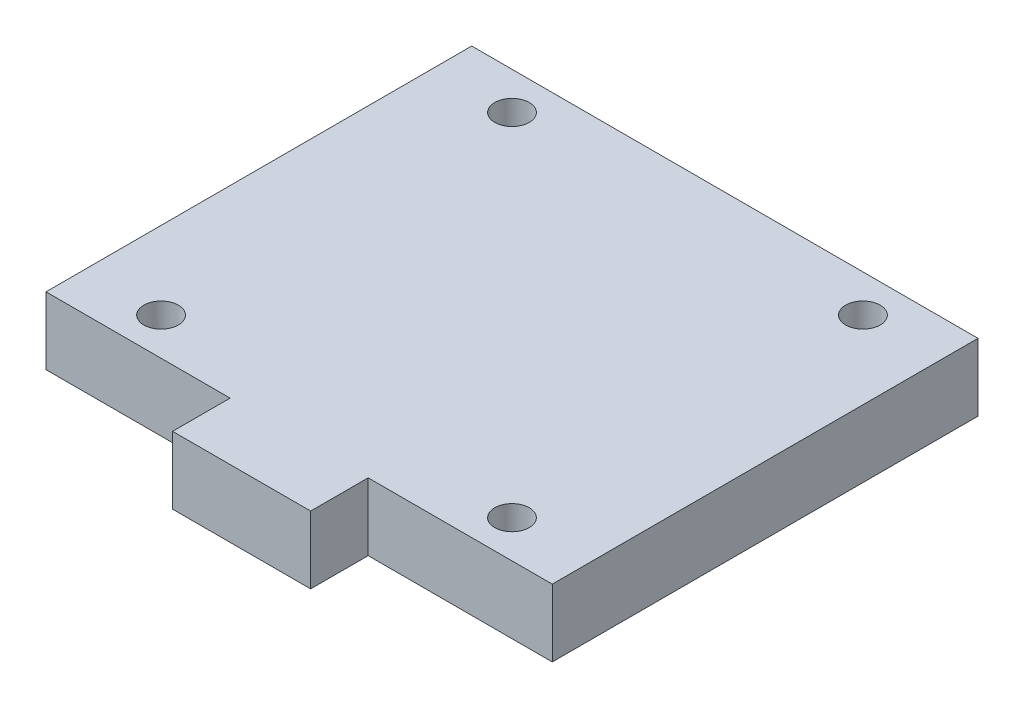
ISO-10303-21;
HEADER;
FILE_DESCRIPTION(('STEP AP214'),'2;1');
FILE_NAME('part.step','',(''),(''),'','','');
FILE_SCHEMA(('AUTOMOTIVE_DESIGN { 1 0 10303 214 1 1 1 1 }'));
ENDSEC;
DATA;
#1=APPLICATION_CONTEXT('core data for automotive mechanical design processes');
#2=APPLICATION_PROTOCOL_DEFINITION('international standard','automotive_design',2000,#1);
#3=PRODUCT_CONTEXT('',#1,'mechanical');
#4=PRODUCT('Part','Part','',(#3));
#5=PRODUCT_RELATED_PRODUCT_CATEGORY('part','',(#4));
#6=PRODUCT_DEFINITION_FORMATION('','',#4);
#7=PRODUCT_DEFINITION_CONTEXT('part definition',#1,'design');
#8=PRODUCT_DEFINITION('design','',#6,#7);
#9=PRODUCT_DEFINITION_SHAPE('','',#8);
#10=(LENGTH_UNIT() NAMED_UNIT(*) SI_UNIT(.MILLI.,.METRE.));
#11=(NAMED_UNIT(*) PLANE_ANGLE_UNIT() SI_UNIT($,.RADIAN.));
#12=(NAMED_UNIT(*) SI_UNIT($,.STERADIAN.) SOLID_ANGLE_UNIT());
#13=UNCERTAINTY_MEASURE_WITH_UNIT(LENGTH_MEASURE(1.E-05),#10,'distance_accuracy_value','');
#14=(GEOMETRIC_REPRESENTATION_CONTEXT(3) GLOBAL_UNCERTAINTY_ASSIGNED_CONTEXT((#13)) GLOBAL_UNIT_ASSIGNED_CONTEXT((#10,
#11,#12)) REPRESENTATION_CONTEXT('',''));
#15=CARTESIAN_POINT('',(0.,0.,0.));
#16=DIRECTION('',(0.,0.,1.));
#17=DIRECTION('',(1.,0.,0.));
#18=AXIS2_PLACEMENT_3D('',#15,#16,#17);
#19=CARTESIAN_POINT('',(0.,5.86,18.5));
#20=DIRECTION('',(0.,0.,-1.));
#21=DIRECTION('',(-1.,0.,0.));
#22=AXIS2_PLACEMENT_3D('',#19,#20,#21);
#23=PLANE('',#22);
#24=DIRECTION('',(1.,0.,0.));
#25=VECTOR('',#24,1.);
#26=CARTESIAN_POINT('',(0.,0.,18.5));
#27=LINE('',#26,#25);
#28=CARTESIAN_POINT('',(-22.,0.,18.5));
#29=VERTEX_POINT('',#28);
#30=CARTESIAN_POINT('',(-6.,0.,18.5));
#31=VERTEX_POINT('',#30);
#32=EDGE_CURVE('E148',#29,#31,#27,.T.);
#33=ORIENTED_EDGE('',*,*,#32,.T.);
#34=DIRECTION('',(0.,-1.,0.));
#35=VECTOR('',#34,1.);
#36=CARTESIAN_POINT('',(-6.,5.86,18.5));
#37=LINE('',#36,#35);
#38=CARTESIAN_POINT('',(-6.,5.86,18.5));
#39=VERTEX_POINT('',#38);
#40=EDGE_CURVE('E11',#39,#31,#37,.T.);
#41=ORIENTED_EDGE('',*,*,#40,.F.);
#42=DIRECTION('',(1.,0.,0.));
#43=VECTOR('',#42,1.);
#44=CARTESIAN_POINT('',(0.,5.86,18.5));
#45=LINE('',#44,#43);
#46=CARTESIAN_POINT('',(-22.,5.86,18.5));
#47=VERTEX_POINT('',#46);
#48=EDGE_CURVE('E188',#47,#39,#45,.T.);
#49=ORIENTED_EDGE('',*,*,#48,.F.);
#50=DIRECTION('',(0.,-1.,0.));
#51=VECTOR('',#50,1.);
#52=CARTESIAN_POINT('',(-22.,5.86,18.5));
#53=LINE('',#52,#51);
#54=EDGE_CURVE('E54',#47,#29,#53,.T.);
#55=ORIENTED_EDGE('',*,*,#54,.T.);
#56=EDGE_LOOP('',(#33,#41,#49,#55));
#57=FACE_BOUND('',#56,.T.);
#58=ADVANCED_FACE('F37',(#57),#23,.F.);
#59=CARTESIAN_POINT('',(-6.,5.86,0.));
#60=DIRECTION('',(1.,0.,0.));
#61=DIRECTION('',(0.,0.,-1.));
#62=AXIS2_PLACEMENT_3D('',#59,#60,#61);
#63=PLANE('',#62);
#64=DIRECTION('',(0.,0.,1.));
#65=VECTOR('',#64,1.);
#66=CARTESIAN_POINT('',(-6.,0.,0.));
#67=LINE('',#66,#65);
#68=CARTESIAN_POINT('',(-5.99999999999999,0.,23.5));
#69=VERTEX_POINT('',#68);
#70=EDGE_CURVE('E150',#31,#69,#67,.T.);
#71=ORIENTED_EDGE('',*,*,#70,.T.);
#72=DIRECTION('',(0.,-1.,0.));
#73=VECTOR('',#72,1.);
#74=CARTESIAN_POINT('',(-5.99999999999999,5.86,23.5));
#75=LINE('',#74,#73);
#76=CARTESIAN_POINT('',(-5.99999999999999,5.86,23.5));
#77=VERTEX_POINT('',#76);
#78=EDGE_CURVE('E46',#77,#69,#75,.T.);
#79=ORIENTED_EDGE('',*,*,#78,.F.);
#80=DIRECTION('',(0.,0.,1.));
#81=VECTOR('',#80,1.);
#82=CARTESIAN_POINT('',(-6.,5.86,0.));
#83=LINE('',#82,#81);
#84=EDGE_CURVE('E92',#39,#77,#83,.T.);
#85=ORIENTED_EDGE('',*,*,#84,.F.);
#86=ORIENTED_EDGE('',*,*,#40,.T.);
#87=EDGE_LOOP('',(#71,#79,#85,#86));
#88=FACE_BOUND('',#87,.T.);
#89=ADVANCED_FACE('F231',(#88),#63,.F.);
#90=CARTESIAN_POINT('',(0.,5.86,23.5));
#91=DIRECTION('',(0.,0.,-1.));
#92=DIRECTION('',(-1.,0.,0.));
#93=AXIS2_PLACEMENT_3D('',#90,#91,#92);
#94=PLANE('',#93);
#95=DIRECTION('',(1.,0.,0.));
#96=VECTOR('',#95,1.);
#97=CARTESIAN_POINT('',(0.,0.,23.5));
#98=LINE('',#97,#96);
#99=CARTESIAN_POINT('',(6.00000000000001,0.,23.5));
#100=VERTEX_POINT('',#99);
#101=EDGE_CURVE('E153',#69,#100,#98,.T.);
#102=ORIENTED_EDGE('',*,*,#101,.T.);
#103=DIRECTION('',(0.,-1.,0.));
#104=VECTOR('',#103,1.);
#105=CARTESIAN_POINT('',(6.00000000000001,5.86,23.5));
#106=LINE('',#105,#104);
#107=CARTESIAN_POINT('',(6.00000000000001,5.86,23.5));
#108=VERTEX_POINT('',#107);
#109=EDGE_CURVE('E171',#108,#100,#106,.T.);
#110=ORIENTED_EDGE('',*,*,#109,.F.);
#111=DIRECTION('',(1.,0.,0.));
#112=VECTOR('',#111,1.);
#113=CARTESIAN_POINT('',(0.,5.86,23.5));
#114=LINE('',#113,#112);
#115=EDGE_CURVE('E178',#77,#108,#114,.T.);
#116=ORIENTED_EDGE('',*,*,#115,.F.);
#117=ORIENTED_EDGE('',*,*,#78,.T.);
#118=EDGE_LOOP('',(#102,#110,#116,#117));
#119=FACE_BOUND('',#118,.T.);
#120=ADVANCED_FACE('F176',(#119),#94,.F.);
#121=CARTESIAN_POINT('',(6.00000000000001,5.86,0.));
#122=DIRECTION('',(1.,0.,0.));
#123=DIRECTION('',(0.,0.,-1.));
#124=AXIS2_PLACEMENT_3D('',#121,#122,#123);
#125=PLANE('',#124);
#126=DIRECTION('',(0.,0.,1.));
#127=VECTOR('',#126,1.);
#128=CARTESIAN_POINT('',(6.00000000000001,0.,0.));
#129=LINE('',#128,#127);
#130=CARTESIAN_POINT('',(6.00000000000001,0.,18.5));
#131=VERTEX_POINT('',#130);
#132=EDGE_CURVE('E156',#131,#100,#129,.T.);
#133=ORIENTED_EDGE('',*,*,#132,.F.);
#134=DIRECTION('',(0.,-1.,0.));
#135=VECTOR('',#134,1.);
#136=CARTESIAN_POINT('',(6.00000000000001,5.86,18.5));
#137=LINE('',#136,#135);
#138=CARTESIAN_POINT('',(6.00000000000001,5.86,18.5));
#139=VERTEX_POINT('',#138);
#140=EDGE_CURVE('E169',#139,#131,#137,.T.);
#141=ORIENTED_EDGE('',*,*,#140,.F.);
#142=DIRECTION('',(0.,0.,1.));
#143=VECTOR('',#142,1.);
#144=CARTESIAN_POINT('',(6.00000000000001,5.86,0.));
#145=LINE('',#144,#143);
#146=EDGE_CURVE('E186',#139,#108,#145,.T.);
#147=ORIENTED_EDGE('',*,*,#146,.T.);
#148=ORIENTED_EDGE('',*,*,#109,.T.);
#149=EDGE_LOOP('',(#133,#141,#147,#148));
#150=FACE_BOUND('',#149,.T.);
#151=ADVANCED_FACE('F184',(#150),#125,.T.);
#152=CARTESIAN_POINT('',(22.,0.,18.5));
#153=VERTEX_POINT('',#152);
#154=EDGE_CURVE('E151',#131,#153,#27,.T.);
#155=ORIENTED_EDGE('',*,*,#154,.T.);
#156=DIRECTION('',(0.,-1.,0.));
#157=VECTOR('',#156,1.);
#158=CARTESIAN_POINT('',(22.,5.86,18.5));
#159=LINE('',#158,#157);
#160=CARTESIAN_POINT('',(22.,5.86,18.5));
#161=VERTEX_POINT('',#160);
#162=EDGE_CURVE('E128',#161,#153,#159,.T.);
#163=ORIENTED_EDGE('',*,*,#162,.F.);
#164=EDGE_CURVE('E116',#139,#161,#45,.T.);
#165=ORIENTED_EDGE('',*,*,#164,.F.);
#166=ORIENTED_EDGE('',*,*,#140,.T.);
#167=EDGE_LOOP('',(#155,#163,#165,#166));
#168=FACE_BOUND('',#167,.T.);
#169=ADVANCED_FACE('F233',(#168),#23,.F.);
#170=CARTESIAN_POINT('',(22.,5.86,0.));
#171=DIRECTION('',(-1.,0.,0.));
#172=DIRECTION('',(0.,0.,1.));
#173=AXIS2_PLACEMENT_3D('',#170,#171,#172);
#174=PLANE('',#173);
#175=DIRECTION('',(0.,0.,-1.));
#176=VECTOR('',#175,1.);
#177=CARTESIAN_POINT('',(22.,0.,0.));
#178=LINE('',#177,#176);
#179=CARTESIAN_POINT('',(22.,0.,-18.5));
#180=VERTEX_POINT('',#179);
#181=EDGE_CURVE('E125',#153,#180,#178,.T.);
#182=ORIENTED_EDGE('',*,*,#181,.T.);
#183=DIRECTION('',(0.,-1.,0.));
#184=VECTOR('',#183,1.);
#185=CARTESIAN_POINT('',(22.,5.86,-18.5));
#186=LINE('',#185,#184);
#187=CARTESIAN_POINT('',(22.,5.86,-18.5));
#188=VERTEX_POINT('',#187);
#189=EDGE_CURVE('E122',#188,#180,#186,.T.);
#190=ORIENTED_EDGE('',*,*,#189,.F.);
#191=DIRECTION('',(0.,0.,-1.));
#192=VECTOR('',#191,1.);
#193=CARTESIAN_POINT('',(22.,5.86,0.));
#194=LINE('',#193,#192);
#195=EDGE_CURVE('E108',#161,#188,#194,.T.);
#196=ORIENTED_EDGE('',*,*,#195,.F.);
#197=ORIENTED_EDGE('',*,*,#162,.T.);
#198=EDGE_LOOP('',(#182,#190,#196,#197));
#199=FACE_BOUND('',#198,.T.);
#200=ADVANCED_FACE('F123',(#199),#174,.F.);
#201=CARTESIAN_POINT('',(0.,5.86,-18.5));
#202=DIRECTION('',(0.,0.,-1.));
#203=DIRECTION('',(-1.,0.,0.));
#204=AXIS2_PLACEMENT_3D('',#201,#202,#203);
#205=PLANE('',#204);
#206=DIRECTION('',(1.,0.,0.));
#207=VECTOR('',#206,1.);
#208=CARTESIAN_POINT('',(0.,0.,-18.5));
#209=LINE('',#208,#207);
#210=CARTESIAN_POINT('',(-22.,0.,-18.5));
#211=VERTEX_POINT('',#210);
#212=EDGE_CURVE('E160',#211,#180,#209,.T.);
#213=ORIENTED_EDGE('',*,*,#212,.F.);
#214=DIRECTION('',(0.,-1.,0.));
#215=VECTOR('',#214,1.);
#216=CARTESIAN_POINT('',(-22.,5.86,-18.5));
#217=LINE('',#216,#215);
#218=CARTESIAN_POINT('',(-22.,5.86,-18.5));
#219=VERTEX_POINT('',#218);
#220=EDGE_CURVE('E80',#219,#211,#217,.T.);
#221=ORIENTED_EDGE('',*,*,#220,.F.);
#222=DIRECTION('',(1.,0.,0.));
#223=VECTOR('',#222,1.);
#224=CARTESIAN_POINT('',(0.,5.86,-18.5));
#225=LINE('',#224,#223);
#226=EDGE_CURVE('E113',#219,#188,#225,.T.);
#227=ORIENTED_EDGE('',*,*,#226,.T.);
#228=ORIENTED_EDGE('',*,*,#189,.T.);
#229=EDGE_LOOP('',(#213,#221,#227,#228));
#230=FACE_BOUND('',#229,.T.);
#231=ADVANCED_FACE('F130',(#230),#205,.T.);
#232=CARTESIAN_POINT('',(-15.25,5.86,-15.25));
#233=DIRECTION('',(0.,-1.,0.));
#234=DIRECTION('',(0.,0.,-1.));
#235=AXIS2_PLACEMENT_3D('',#232,#233,#234);
#236=CYLINDRICAL_SURFACE('',#235,1.5);
#237=CARTESIAN_POINT('',(-15.25,5.86,-15.25));
#238=DIRECTION('',(0.,1.,0.));
#239=DIRECTION('',(0.,0.,1.));
#240=AXIS2_PLACEMENT_3D('',#237,#238,#239);
#241=CIRCLE('',#240,1.5);
#242=CARTESIAN_POINT('',(-15.25,5.86,-16.75));
#243=VERTEX_POINT('',#242);
#244=EDGE_CURVE('E192',#243,#243,#241,.T.);
#245=CARTESIAN_POINT('',(-15.25,0.,-15.25));
#246=DIRECTION('',(0.,1.,0.));
#247=DIRECTION('',(0.,0.,1.));
#248=AXIS2_PLACEMENT_3D('',#245,#246,#247);
#249=CIRCLE('',#248,1.5);
#250=CARTESIAN_POINT('',(-15.25,0.,-16.75));
#251=VERTEX_POINT('',#250);
#252=EDGE_CURVE('E145',#251,#251,#249,.T.);
#253=CARTESIAN_POINT('',(-15.25,5.86,-16.75));
#254=CARTESIAN_POINT('',(-15.25,5.79895833333333,-16.75));
#255=CARTESIAN_POINT('',(-15.25,5.73791666666667,-16.75));
#256=CARTESIAN_POINT('',(-15.25,5.61583333333333,-16.75));
#257=CARTESIAN_POINT('',(-15.25,5.55479166666667,-16.75));
#258=CARTESIAN_POINT('',(-15.25,5.43270833333333,-16.75));
#259=CARTESIAN_POINT('',(-15.25,5.37166666666667,-16.75));
#260=CARTESIAN_POINT('',(-15.25,5.24958333333333,-16.75));
#261=CARTESIAN_POINT('',(-15.25,5.18854166666667,-16.75));
#262=CARTESIAN_POINT('',(-15.25,5.06645833333333,-16.75));
#263=CARTESIAN_POINT('',(-15.25,5.00541666666667,-16.75));
#264=CARTESIAN_POINT('',(-15.25,4.88333333333333,-16.75));
#265=CARTESIAN_POINT('',(-15.25,4.82229166666667,-16.75));
#266=CARTESIAN_POINT('',(-15.25,4.70020833333333,-16.75));
#267=CARTESIAN_POINT('',(-15.25,4.63916666666667,-16.75));
#268=CARTESIAN_POINT('',(-15.25,4.51708333333333,-16.75));
#269=CARTESIAN_POINT('',(-15.25,4.45604166666667,-16.75));
#270=CARTESIAN_POINT('',(-15.25,4.33395833333333,-16.75));
#271=CARTESIAN_POINT('',(-15.25,4.27291666666667,-16.75));
#272=CARTESIAN_POINT('',(-15.25,4.15083333333333,-16.75));
#273=CARTESIAN_POINT('',(-15.25,4.08979166666667,-16.75));
#274=CARTESIAN_POINT('',(-15.25,3.96770833333333,-16.75));
#275=CARTESIAN_POINT('',(-15.25,3.90666666666667,-16.75));
#276=CARTESIAN_POINT('',(-15.25,3.78458333333333,-16.75));
#277=CARTESIAN_POINT('',(-15.25,3.72354166666667,-16.75));
#278=CARTESIAN_POINT('',(-15.25,3.60145833333333,-16.75));
#279=CARTESIAN_POINT('',(-15.25,3.54041666666667,-16.75));
#280=CARTESIAN_POINT('',(-15.25,3.41833333333333,-16.75));
#281=CARTESIAN_POINT('',(-15.25,3.35729166666667,-16.75));
#282=CARTESIAN_POINT('',(-15.25,3.23520833333333,-16.75));
#283=CARTESIAN_POINT('',(-15.25,3.17416666666667,-16.75));
#284=CARTESIAN_POINT('',(-15.25,3.05208333333333,-16.75));
#285=CARTESIAN_POINT('',(-15.25,2.99104166666667,-16.75));
#286=CARTESIAN_POINT('',(-15.25,2.86895833333333,-16.75));
#287=CARTESIAN_POINT('',(-15.25,2.80791666666667,-16.75));
#288=CARTESIAN_POINT('',(-15.25,2.68583333333333,-16.75));
#289=CARTESIAN_POINT('',(-15.25,2.62479166666667,-16.75));
#290=CARTESIAN_POINT('',(-15.25,2.50270833333333,-16.75));
#291=CARTESIAN_POINT('',(-15.25,2.44166666666667,-16.75));
#292=CARTESIAN_POINT('',(-15.25,2.31958333333333,-16.75));
#293=CARTESIAN_POINT('',(-15.25,2.25854166666667,-16.75));
#294=CARTESIAN_POINT('',(-15.25,2.13645833333333,-16.75));
#295=CARTESIAN_POINT('',(-15.25,2.07541666666667,-16.75));
#296=CARTESIAN_POINT('',(-15.25,1.95333333333333,-16.75));
#297=CARTESIAN_POINT('',(-15.25,1.89229166666667,-16.75));
#298=CARTESIAN_POINT('',(-15.25,1.77020833333333,-16.75));
#299=CARTESIAN_POINT('',(-15.25,1.70916666666667,-16.75));
#300=CARTESIAN_POINT('',(-15.25,1.58708333333333,-16.75));
#301=CARTESIAN_POINT('',(-15.25,1.52604166666667,-16.75));
#302=CARTESIAN_POINT('',(-15.25,1.40395833333333,-16.75));
#303=CARTESIAN_POINT('',(-15.25,1.34291666666667,-16.75));
#304=CARTESIAN_POINT('',(-15.25,1.22083333333333,-16.75));
#305=CARTESIAN_POINT('',(-15.25,1.15979166666667,-16.75));
#306=CARTESIAN_POINT('',(-15.25,1.03770833333333,-16.75));
#307=CARTESIAN_POINT('',(-15.25,0.976666666666666,-16.75));
#308=CARTESIAN_POINT('',(-15.25,0.854583333333333,-16.75));
#309=CARTESIAN_POINT('',(-15.25,0.793541666666666,-16.75));
#310=CARTESIAN_POINT('',(-15.25,0.671458333333333,-16.75));
#311=CARTESIAN_POINT('',(-15.25,0.610416666666666,-16.75));
#312=CARTESIAN_POINT('',(-15.25,0.488333333333333,-16.75));
#313=CARTESIAN_POINT('',(-15.25,0.427291666666666,-16.75));
#314=CARTESIAN_POINT('',(-15.25,0.305208333333333,-16.75));
#315=CARTESIAN_POINT('',(-15.25,0.244166666666666,-16.75));
#316=CARTESIAN_POINT('',(-15.25,0.122083333333333,-16.75));
#317=CARTESIAN_POINT('',(-15.25,0.0610416666666659,-16.75));
#318=CARTESIAN_POINT('',(-15.25,0.,-16.75));
#319=B_SPLINE_CURVE_WITH_KNOTS('',3,(#253,#254,#255,#256,#257,#258,#259,#260,#261,#262,#263,
#264,#265,#266,#267,#268,#269,#270,#271,#272,#273,#274,#275,#276,#277,#278,#279,#280,#281,#282,
#283,#284,#285,#286,#287,#288,#289,#290,#291,#292,#293,#294,#295,#296,#297,#298,#299,#300,#301,
#302,#303,#304,#305,#306,#307,#308,#309,#310,#311,#312,#313,#314,#315,#316,#317,#318),
.UNSPECIFIED.,.F.,.F.,(4,2,2,2,2,2,2,2,2,2,2,2,2,2,2,2,2,2,2,2,2,2,2,2,2,2,2,2,2,2,2,2,4),(0.,
0.183125,0.36625,0.549375,0.7325,0.915625000000001,1.09875,1.281875,1.465,1.648125,1.83125,
2.014375,2.1975,2.380625,2.56375,2.746875,2.93,3.113125,3.29625,3.479375,3.6625,3.845625,
4.02875,4.211875,4.395,4.578125,4.76125,4.944375,5.1275,5.310625,5.49375,5.676875,5.86),.UNSPECIFIED.);
#320=EDGE_CURVE('BSEAM216',#243,#251,#319,.T.);
#321=ORIENTED_EDGE('',*,*,#244,.T.);
#322=ORIENTED_EDGE('',*,*,#252,.F.);
#323=ORIENTED_EDGE('',*,*,#320,.T.);
#324=ORIENTED_EDGE('',*,*,#320,.F.);
#325=EDGE_LOOP('',(#321,#323,#322,#324));
#326=FACE_BOUND('',#325,.T.);
#327=ADVANCED_FACE('F216',(#326),#236,.F.);
#328=CARTESIAN_POINT('',(15.25,5.86,-15.25));
#329=DIRECTION('',(0.,-1.,0.));
#330=DIRECTION('',(0.,0.,-1.));
#331=AXIS2_PLACEMENT_3D('',#328,#329,#330);
#332=CYLINDRICAL_SURFACE('',#331,1.5);
#333=CARTESIAN_POINT('',(15.25,5.86,-15.25));
#334=DIRECTION('',(0.,1.,0.));
#335=DIRECTION('',(0.,0.,1.));
#336=AXIS2_PLACEMENT_3D('',#333,#334,#335);
#337=CIRCLE('',#336,1.5);
#338=CARTESIAN_POINT('',(15.25,5.86,-16.75));
#339=VERTEX_POINT('',#338);
#340=EDGE_CURVE('E195',#339,#339,#337,.T.);
#341=CARTESIAN_POINT('',(15.25,0.,-15.25));
#342=DIRECTION('',(0.,1.,0.));
#343=DIRECTION('',(0.,0.,1.));
#344=AXIS2_PLACEMENT_3D('',#341,#342,#343);
#345=CIRCLE('',#344,1.5);
#346=CARTESIAN_POINT('',(15.25,0.,-16.75));
#347=VERTEX_POINT('',#346);
#348=EDGE_CURVE('E142',#347,#347,#345,.T.);
#349=CARTESIAN_POINT('',(15.25,5.86,-16.75));
#350=CARTESIAN_POINT('',(15.25,5.79895833333333,-16.75));
#351=CARTESIAN_POINT('',(15.25,5.73791666666667,-16.75));
#352=CARTESIAN_POINT('',(15.25,5.61583333333333,-16.75));
#353=CARTESIAN_POINT('',(15.25,5.55479166666667,-16.75));
#354=CARTESIAN_POINT('',(15.25,5.43270833333333,-16.75));
#355=CARTESIAN_POINT('',(15.25,5.37166666666667,-16.75));
#356=CARTESIAN_POINT('',(15.25,5.24958333333333,-16.75));
#357=CARTESIAN_POINT('',(15.25,5.18854166666667,-16.75));
#358=CARTESIAN_POINT('',(15.25,5.06645833333333,-16.75));
#359=CARTESIAN_POINT('',(15.25,5.00541666666667,-16.75));
#360=CARTESIAN_POINT('',(15.25,4.88333333333333,-16.75));
#361=CARTESIAN_POINT('',(15.25,4.82229166666667,-16.75));
#362=CARTESIAN_POINT('',(15.25,4.70020833333333,-16.75));
#363=CARTESIAN_POINT('',(15.25,4.63916666666667,-16.75));
#364=CARTESIAN_POINT('',(15.25,4.51708333333333,-16.75));
#365=CARTESIAN_POINT('',(15.25,4.45604166666667,-16.75));
#366=CARTESIAN_POINT('',(15.25,4.33395833333333,-16.75));
#367=CARTESIAN_POINT('',(15.25,4.27291666666667,-16.75));
#368=CARTESIAN_POINT('',(15.25,4.15083333333333,-16.75));
#369=CARTESIAN_POINT('',(15.25,4.08979166666667,-16.75));
#370=CARTESIAN_POINT('',(15.25,3.96770833333333,-16.75));
#371=CARTESIAN_POINT('',(15.25,3.90666666666667,-16.75));
#372=CARTESIAN_POINT('',(15.25,3.78458333333333,-16.75));
#373=CARTESIAN_POINT('',(15.25,3.72354166666667,-16.75));
#374=CARTESIAN_POINT('',(15.25,3.60145833333333,-16.75));
#375=CARTESIAN_POINT('',(15.25,3.54041666666667,-16.75));
#376=CARTESIAN_POINT('',(15.25,3.41833333333333,-16.75));
#377=CARTESIAN_POINT('',(15.25,3.35729166666667,-16.75));
#378=CARTESIAN_POINT('',(15.25,3.23520833333333,-16.75));
#379=CARTESIAN_POINT('',(15.25,3.17416666666667,-16.75));
#380=CARTESIAN_POINT('',(15.25,3.05208333333333,-16.75));
#381=CARTESIAN_POINT('',(15.25,2.99104166666667,-16.75));
#382=CARTESIAN_POINT('',(15.25,2.86895833333333,-16.75));
#383=CARTESIAN_POINT('',(15.25,2.80791666666667,-16.75));
#384=CARTESIAN_POINT('',(15.25,2.68583333333333,-16.75));
#385=CARTESIAN_POINT('',(15.25,2.62479166666667,-16.75));
#386=CARTESIAN_POINT('',(15.25,2.50270833333333,-16.75));
#387=CARTESIAN_POINT('',(15.25,2.44166666666667,-16.75));
#388=CARTESIAN_POINT('',(15.25,2.31958333333333,-16.75));
#389=CARTESIAN_POINT('',(15.25,2.25854166666667,-16.75));
#390=CARTESIAN_POINT('',(15.25,2.13645833333333,-16.75));
#391=CARTESIAN_POINT('',(15.25,2.07541666666667,-16.75));
#392=CARTESIAN_POINT('',(15.25,1.95333333333333,-16.75));
#393=CARTESIAN_POINT('',(15.25,1.89229166666667,-16.75));
#394=CARTESIAN_POINT('',(15.25,1.77020833333333,-16.75));
#395=CARTESIAN_POINT('',(15.25,1.70916666666667,-16.75));
#396=CARTESIAN_POINT('',(15.25,1.58708333333333,-16.75));
#397=CARTESIAN_POINT('',(15.25,1.52604166666667,-16.75));
#398=CARTESIAN_POINT('',(15.25,1.40395833333333,-16.75));
#399=CARTESIAN_POINT('',(15.25,1.34291666666667,-16.75));
#400=CARTESIAN_POINT('',(15.25,1.22083333333333,-16.75));
#401=CARTESIAN_POINT('',(15.25,1.15979166666667,-16.75));
#402=CARTESIAN_POINT('',(15.25,1.03770833333333,-16.75));
#403=CARTESIAN_POINT('',(15.25,0.976666666666666,-16.75));
#404=CARTESIAN_POINT('',(15.25,0.854583333333333,-16.75));
#405=CARTESIAN_POINT('',(15.25,0.793541666666666,-16.75));
#406=CARTESIAN_POINT('',(15.25,0.671458333333333,-16.75));
#407=CARTESIAN_POINT('',(15.25,0.610416666666666,-16.75));
#408=CARTESIAN_POINT('',(15.25,0.488333333333333,-16.75));
#409=CARTESIAN_POINT('',(15.25,0.427291666666666,-16.75));
#410=CARTESIAN_POINT('',(15.25,0.305208333333333,-16.75));
#411=CARTESIAN_POINT('',(15.25,0.244166666666666,-16.75));
#412=CARTESIAN_POINT('',(15.25,0.122083333333333,-16.75));
#413=CARTESIAN_POINT('',(15.25,0.0610416666666659,-16.75));
#414=CARTESIAN_POINT('',(15.25,0.,-16.75));
#415=B_SPLINE_CURVE_WITH_KNOTS('',3,(#349,#350,#351,#352,#353,#354,#355,#356,#357,#358,#359,
#360,#361,#362,#363,#364,#365,#366,#367,#368,#369,#370,#371,#372,#373,#374,#375,#376,#377,#378,
#379,#380,#381,#382,#383,#384,#385,#386,#387,#388,#389,#390,#391,#392,#393,#394,#395,#396,#397,
#398,#399,#400,#401,#402,#403,#404,#405,#406,#407,#408,#409,#410,#411,#412,#413,#414),
.UNSPECIFIED.,.F.,.F.,(4,2,2,2,2,2,2,2,2,2,2,2,2,2,2,2,2,2,2,2,2,2,2,2,2,2,2,2,2,2,2,2,4),(0.,
0.183125,0.36625,0.549375,0.7325,0.915625000000001,1.09875,1.281875,1.465,1.648125,1.83125,
2.014375,2.1975,2.380625,2.56375,2.746875,2.93,3.113125,3.29625,3.479375,3.6625,3.845625,
4.02875,4.211875,4.395,4.578125,4.76125,4.944375,5.1275,5.310625,5.49375,5.676875,5.86),.UNSPECIFIED.);
#416=EDGE_CURVE('BSEAM219',#339,#347,#415,.T.);
#417=ORIENTED_EDGE('',*,*,#340,.T.);
#418=ORIENTED_EDGE('',*,*,#348,.F.);
#419=ORIENTED_EDGE('',*,*,#416,.T.);
#420=ORIENTED_EDGE('',*,*,#416,.F.);
#421=EDGE_LOOP('',(#417,#419,#418,#420));
#422=FACE_BOUND('',#421,.T.);
#423=ADVANCED_FACE('F219',(#422),#332,.F.);
#424=CARTESIAN_POINT('',(15.25,5.86,15.25));
#425=DIRECTION('',(0.,-1.,0.));
#426=DIRECTION('',(0.,0.,-1.));
#427=AXIS2_PLACEMENT_3D('',#424,#425,#426);
#428=CYLINDRICAL_SURFACE('',#427,1.5);
#429=CARTESIAN_POINT('',(15.25,5.86,15.25));
#430=DIRECTION('',(0.,1.,0.));
#431=DIRECTION('',(0.,0.,1.));
#432=AXIS2_PLACEMENT_3D('',#429,#430,#431);
#433=CIRCLE('',#432,1.5);
#434=CARTESIAN_POINT('',(15.25,5.86,13.75));
#435=VERTEX_POINT('',#434);
#436=EDGE_CURVE('E198',#435,#435,#433,.T.);
#437=CARTESIAN_POINT('',(15.25,0.,15.25));
#438=DIRECTION('',(0.,1.,0.));
#439=DIRECTION('',(0.,0.,1.));
#440=AXIS2_PLACEMENT_3D('',#437,#438,#439);
#441=CIRCLE('',#440,1.5);
#442=CARTESIAN_POINT('',(15.25,0.,13.75));
#443=VERTEX_POINT('',#442);
#444=EDGE_CURVE('E139',#443,#443,#441,.T.);
#445=CARTESIAN_POINT('',(15.25,5.86,13.75));
#446=CARTESIAN_POINT('',(15.25,5.79895833333333,13.75));
#447=CARTESIAN_POINT('',(15.25,5.73791666666667,13.75));
#448=CARTESIAN_POINT('',(15.25,5.61583333333333,13.75));
#449=CARTESIAN_POINT('',(15.25,5.55479166666667,13.75));
#450=CARTESIAN_POINT('',(15.25,5.43270833333333,13.75));
#451=CARTESIAN_POINT('',(15.25,5.37166666666667,13.75));
#452=CARTESIAN_POINT('',(15.25,5.24958333333333,13.75));
#453=CARTESIAN_POINT('',(15.25,5.18854166666667,13.75));
#454=CARTESIAN_POINT('',(15.25,5.06645833333333,13.75));
#455=CARTESIAN_POINT('',(15.25,5.00541666666667,13.75));
#456=CARTESIAN_POINT('',(15.25,4.88333333333333,13.75));
#457=CARTESIAN_POINT('',(15.25,4.82229166666667,13.75));
#458=CARTESIAN_POINT('',(15.25,4.70020833333333,13.75));
#459=CARTESIAN_POINT('',(15.25,4.63916666666667,13.75));
#460=CARTESIAN_POINT('',(15.25,4.51708333333333,13.75));
#461=CARTESIAN_POINT('',(15.25,4.45604166666667,13.75));
#462=CARTESIAN_POINT('',(15.25,4.33395833333333,13.75));
#463=CARTESIAN_POINT('',(15.25,4.27291666666667,13.75));
#464=CARTESIAN_POINT('',(15.25,4.15083333333333,13.75));
#465=CARTESIAN_POINT('',(15.25,4.08979166666667,13.75));
#466=CARTESIAN_POINT('',(15.25,3.96770833333333,13.75));
#467=CARTESIAN_POINT('',(15.25,3.90666666666667,13.75));
#468=CARTESIAN_POINT('',(15.25,3.78458333333333,13.75));
#469=CARTESIAN_POINT('',(15.25,3.72354166666667,13.75));
#470=CARTESIAN_POINT('',(15.25,3.60145833333333,13.75));
#471=CARTESIAN_POINT('',(15.25,3.54041666666667,13.75));
#472=CARTESIAN_POINT('',(15.25,3.41833333333333,13.75));
#473=CARTESIAN_POINT('',(15.25,3.35729166666667,13.75));
#474=CARTESIAN_POINT('',(15.25,3.23520833333333,13.75));
#475=CARTESIAN_POINT('',(15.25,3.17416666666667,13.75));
#476=CARTESIAN_POINT('',(15.25,3.05208333333333,13.75));
#477=CARTESIAN_POINT('',(15.25,2.99104166666667,13.75));
#478=CARTESIAN_POINT('',(15.25,2.86895833333333,13.75));
#479=CARTESIAN_POINT('',(15.25,2.80791666666667,13.75));
#480=CARTESIAN_POINT('',(15.25,2.68583333333333,13.75));
#481=CARTESIAN_POINT('',(15.25,2.62479166666667,13.75));
#482=CARTESIAN_POINT('',(15.25,2.50270833333333,13.75));
#483=CARTESIAN_POINT('',(15.25,2.44166666666667,13.75));
#484=CARTESIAN_POINT('',(15.25,2.31958333333333,13.75));
#485=CARTESIAN_POINT('',(15.25,2.25854166666667,13.75));
#486=CARTESIAN_POINT('',(15.25,2.13645833333333,13.75));
#487=CARTESIAN_POINT('',(15.25,2.07541666666667,13.75));
#488=CARTESIAN_POINT('',(15.25,1.95333333333333,13.75));
#489=CARTESIAN_POINT('',(15.25,1.89229166666667,13.75));
#490=CARTESIAN_POINT('',(15.25,1.77020833333333,13.75));
#491=CARTESIAN_POINT('',(15.25,1.70916666666667,13.75));
#492=CARTESIAN_POINT('',(15.25,1.58708333333333,13.75));
#493=CARTESIAN_POINT('',(15.25,1.52604166666667,13.75));
#494=CARTESIAN_POINT('',(15.25,1.40395833333333,13.75));
#495=CARTESIAN_POINT('',(15.25,1.34291666666667,13.75));
#496=CARTESIAN_POINT('',(15.25,1.22083333333333,13.75));
#497=CARTESIAN_POINT('',(15.25,1.15979166666667,13.75));
#498=CARTESIAN_POINT('',(15.25,1.03770833333333,13.75));
#499=CARTESIAN_POINT('',(15.25,0.976666666666666,13.75));
#500=CARTESIAN_POINT('',(15.25,0.854583333333333,13.75));
#501=CARTESIAN_POINT('',(15.25,0.793541666666666,13.75));
#502=CARTESIAN_POINT('',(15.25,0.671458333333333,13.75));
#503=CARTESIAN_POINT('',(15.25,0.610416666666666,13.75));
#504=CARTESIAN_POINT('',(15.25,0.488333333333333,13.75));
#505=CARTESIAN_POINT('',(15.25,0.427291666666666,13.75));
#506=CARTESIAN_POINT('',(15.25,0.305208333333333,13.75));
#507=CARTESIAN_POINT('',(15.25,0.244166666666666,13.75));
#508=CARTESIAN_POINT('',(15.25,0.122083333333333,13.75));
#509=CARTESIAN_POINT('',(15.25,0.0610416666666659,13.75));
#510=CARTESIAN_POINT('',(15.25,0.,13.75));
#511=B_SPLINE_CURVE_WITH_KNOTS('',3,(#445,#446,#447,#448,#449,#450,#451,#452,#453,#454,#455,
#456,#457,#458,#459,#460,#461,#462,#463,#464,#465,#466,#467,#468,#469,#470,#471,#472,#473,#474,
#475,#476,#477,#478,#479,#480,#481,#482,#483,#484,#485,#486,#487,#488,#489,#490,#491,#492,#493,
#494,#495,#496,#497,#498,#499,#500,#501,#502,#503,#504,#505,#506,#507,#508,#509,#510),
.UNSPECIFIED.,.F.,.F.,(4,2,2,2,2,2,2,2,2,2,2,2,2,2,2,2,2,2,2,2,2,2,2,2,2,2,2,2,2,2,2,2,4),(0.,
0.183125,0.36625,0.549375,0.7325,0.915625000000001,1.09875,1.281875,1.465,1.648125,1.83125,
2.014375,2.1975,2.380625,2.56375,2.746875,2.93,3.113125,3.29625,3.479375,3.6625,3.845625,
4.02875,4.211875,4.395,4.578125,4.76125,4.944375,5.1275,5.310625,5.49375,5.676875,5.86),.UNSPECIFIED.);
#512=EDGE_CURVE('BSEAM250',#435,#443,#511,.T.);
#513=ORIENTED_EDGE('',*,*,#436,.T.);
#514=ORIENTED_EDGE('',*,*,#444,.F.);
#515=ORIENTED_EDGE('',*,*,#512,.T.);
#516=ORIENTED_EDGE('',*,*,#512,.F.);
#517=EDGE_LOOP('',(#513,#515,#514,#516));
#518=FACE_BOUND('',#517,.T.);
#519=ADVANCED_FACE('F250',(#518),#428,.F.);
#520=CARTESIAN_POINT('',(-15.25,5.86,15.25));
#521=DIRECTION('',(0.,-1.,0.));
#522=DIRECTION('',(0.,0.,-1.));
#523=AXIS2_PLACEMENT_3D('',#520,#521,#522);
#524=CYLINDRICAL_SURFACE('',#523,1.5);
#525=CARTESIAN_POINT('',(-15.25,5.86,15.25));
#526=DIRECTION('',(0.,1.,0.));
#527=DIRECTION('',(0.,0.,1.));
#528=AXIS2_PLACEMENT_3D('',#525,#526,#527);
#529=CIRCLE('',#528,1.5);
#530=CARTESIAN_POINT('',(-15.25,5.86,13.75));
#531=VERTEX_POINT('',#530);
#532=EDGE_CURVE('E165',#531,#531,#529,.T.);
#533=CARTESIAN_POINT('',(-15.25,0.,15.25));
#534=DIRECTION('',(0.,1.,0.));
#535=DIRECTION('',(0.,0.,1.));
#536=AXIS2_PLACEMENT_3D('',#533,#534,#535);
#537=CIRCLE('',#536,1.5);
#538=CARTESIAN_POINT('',(-15.25,0.,13.75));
#539=VERTEX_POINT('',#538);
#540=EDGE_CURVE('E136',#539,#539,#537,.T.);
#541=CARTESIAN_POINT('',(-15.25,5.86,13.75));
#542=CARTESIAN_POINT('',(-15.25,5.79895833333333,13.75));
#543=CARTESIAN_POINT('',(-15.25,5.73791666666667,13.75));
#544=CARTESIAN_POINT('',(-15.25,5.61583333333333,13.75));
#545=CARTESIAN_POINT('',(-15.25,5.55479166666667,13.75));
#546=CARTESIAN_POINT('',(-15.25,5.43270833333333,13.75));
#547=CARTESIAN_POINT('',(-15.25,5.37166666666667,13.75));
#548=CARTESIAN_POINT('',(-15.25,5.24958333333333,13.75));
#549=CARTESIAN_POINT('',(-15.25,5.18854166666667,13.75));
#550=CARTESIAN_POINT('',(-15.25,5.06645833333333,13.75));
#551=CARTESIAN_POINT('',(-15.25,5.00541666666667,13.75));
#552=CARTESIAN_POINT('',(-15.25,4.88333333333333,13.75));
#553=CARTESIAN_POINT('',(-15.25,4.82229166666667,13.75));
#554=CARTESIAN_POINT('',(-15.25,4.70020833333333,13.75));
#555=CARTESIAN_POINT('',(-15.25,4.63916666666667,13.75));
#556=CARTESIAN_POINT('',(-15.25,4.51708333333333,13.75));
#557=CARTESIAN_POINT('',(-15.25,4.45604166666667,13.75));
#558=CARTESIAN_POINT('',(-15.25,4.33395833333333,13.75));
#559=CARTESIAN_POINT('',(-15.25,4.27291666666667,13.75));
#560=CARTESIAN_POINT('',(-15.25,4.15083333333333,13.75));
#561=CARTESIAN_POINT('',(-15.25,4.08979166666667,13.75));
#562=CARTESIAN_POINT('',(-15.25,3.96770833333333,13.75));
#563=CARTESIAN_POINT('',(-15.25,3.90666666666667,13.75));
#564=CARTESIAN_POINT('',(-15.25,3.78458333333333,13.75));
#565=CARTESIAN_POINT('',(-15.25,3.72354166666667,13.75));
#566=CARTESIAN_POINT('',(-15.25,3.60145833333333,13.75));
#567=CARTESIAN_POINT('',(-15.25,3.54041666666667,13.75));
#568=CARTESIAN_POINT('',(-15.25,3.41833333333333,13.75));
#569=CARTESIAN_POINT('',(-15.25,3.35729166666667,13.75));
#570=CARTESIAN_POINT('',(-15.25,3.23520833333333,13.75));
#571=CARTESIAN_POINT('',(-15.25,3.17416666666667,13.75));
#572=CARTESIAN_POINT('',(-15.25,3.05208333333333,13.75));
#573=CARTESIAN_POINT('',(-15.25,2.99104166666667,13.75));
#574=CARTESIAN_POINT('',(-15.25,2.86895833333333,13.75));
#575=CARTESIAN_POINT('',(-15.25,2.80791666666667,13.75));
#576=CARTESIAN_POINT('',(-15.25,2.68583333333333,13.75));
#577=CARTESIAN_POINT('',(-15.25,2.62479166666667,13.75));
#578=CARTESIAN_POINT('',(-15.25,2.50270833333333,13.75));
#579=CARTESIAN_POINT('',(-15.25,2.44166666666667,13.75));
#580=CARTESIAN_POINT('',(-15.25,2.31958333333333,13.75));
#581=CARTESIAN_POINT('',(-15.25,2.25854166666667,13.75));
#582=CARTESIAN_POINT('',(-15.25,2.13645833333333,13.75));
#583=CARTESIAN_POINT('',(-15.25,2.07541666666667,13.75));
#584=CARTESIAN_POINT('',(-15.25,1.95333333333333,13.75));
#585=CARTESIAN_POINT('',(-15.25,1.89229166666667,13.75));
#586=CARTESIAN_POINT('',(-15.25,1.77020833333333,13.75));
#587=CARTESIAN_POINT('',(-15.25,1.70916666666667,13.75));
#588=CARTESIAN_POINT('',(-15.25,1.58708333333333,13.75));
#589=CARTESIAN_POINT('',(-15.25,1.52604166666667,13.75));
#590=CARTESIAN_POINT('',(-15.25,1.40395833333333,13.75));
#591=CARTESIAN_POINT('',(-15.25,1.34291666666667,13.75));
#592=CARTESIAN_POINT('',(-15.25,1.22083333333333,13.75));
#593=CARTESIAN_POINT('',(-15.25,1.15979166666667,13.75));
#594=CARTESIAN_POINT('',(-15.25,1.03770833333333,13.75));
#595=CARTESIAN_POINT('',(-15.25,0.976666666666666,13.75));
#596=CARTESIAN_POINT('',(-15.25,0.854583333333333,13.75));
#597=CARTESIAN_POINT('',(-15.25,0.793541666666666,13.75));
#598=CARTESIAN_POINT('',(-15.25,0.671458333333333,13.75));
#599=CARTESIAN_POINT('',(-15.25,0.610416666666666,13.75));
#600=CARTESIAN_POINT('',(-15.25,0.488333333333333,13.75));
#601=CARTESIAN_POINT('',(-15.25,0.427291666666666,13.75));
#602=CARTESIAN_POINT('',(-15.25,0.305208333333333,13.75));
#603=CARTESIAN_POINT('',(-15.25,0.244166666666666,13.75));
#604=CARTESIAN_POINT('',(-15.25,0.122083333333333,13.75));
#605=CARTESIAN_POINT('',(-15.25,0.0610416666666659,13.75));
#606=CARTESIAN_POINT('',(-15.25,0.,13.75));
#607=B_SPLINE_CURVE_WITH_KNOTS('',3,(#541,#542,#543,#544,#545,#546,#547,#548,#549,#550,#551,
#552,#553,#554,#555,#556,#557,#558,#559,#560,#561,#562,#563,#564,#565,#566,#567,#568,#569,#570,
#571,#572,#573,#574,#575,#576,#577,#578,#579,#580,#581,#582,#583,#584,#585,#586,#587,#588,#589,
#590,#591,#592,#593,#594,#595,#596,#597,#598,#599,#600,#601,#602,#603,#604,#605,#606),
.UNSPECIFIED.,.F.,.F.,(4,2,2,2,2,2,2,2,2,2,2,2,2,2,2,2,2,2,2,2,2,2,2,2,2,2,2,2,2,2,2,2,4),(0.,
0.183125,0.36625,0.549375,0.7325,0.915625000000001,1.09875,1.281875,1.465,1.648125,1.83125,
2.014375,2.1975,2.380625,2.56375,2.746875,2.93,3.113125,3.29625,3.479375,3.6625,3.845625,
4.02875,4.211875,4.395,4.578125,4.76125,4.944375,5.1275,5.310625,5.49375,5.676875,5.86),.UNSPECIFIED.);
#608=EDGE_CURVE('BSEAM39',#531,#539,#607,.T.);
#609=ORIENTED_EDGE('',*,*,#532,.T.);
#610=ORIENTED_EDGE('',*,*,#540,.F.);
#611=ORIENTED_EDGE('',*,*,#608,.T.);
#612=ORIENTED_EDGE('',*,*,#608,.F.);
#613=EDGE_LOOP('',(#609,#611,#610,#612));
#614=FACE_BOUND('',#613,.T.);
#615=ADVANCED_FACE('F39',(#614),#524,.F.);
#616=CARTESIAN_POINT('',(-22.,5.86,0.));
#617=DIRECTION('',(-1.,0.,0.));
#618=DIRECTION('',(0.,0.,1.));
#619=AXIS2_PLACEMENT_3D('',#616,#617,#618);
#620=PLANE('',#619);
#621=DIRECTION('',(0.,0.,-1.));
#622=VECTOR('',#621,1.);
#623=CARTESIAN_POINT('',(-22.,0.,0.));
#624=LINE('',#623,#622);
#625=EDGE_CURVE('E162',#29,#211,#624,.T.);
#626=ORIENTED_EDGE('',*,*,#625,.F.);
#627=ORIENTED_EDGE('',*,*,#54,.F.);
#628=DIRECTION('',(0.,0.,-1.));
#629=VECTOR('',#628,1.);
#630=CARTESIAN_POINT('',(-22.,5.86,0.));
#631=LINE('',#630,#629);
#632=EDGE_CURVE('E131',#47,#219,#631,.T.);
#633=ORIENTED_EDGE('',*,*,#632,.T.);
#634=ORIENTED_EDGE('',*,*,#220,.T.);
#635=EDGE_LOOP('',(#626,#627,#633,#634));
#636=FACE_BOUND('',#635,.T.);
#637=ADVANCED_FACE('F208',(#636),#620,.T.);
#638=CARTESIAN_POINT('',(0.,5.86,0.));
#639=DIRECTION('',(0.,1.,0.));
#640=DIRECTION('',(0.,0.,1.));
#641=AXIS2_PLACEMENT_3D('',#638,#639,#640);
#642=PLANE('',#641);
#643=ORIENTED_EDGE('',*,*,#532,.F.);
#644=EDGE_LOOP('',(#643));
#645=FACE_BOUND('',#644,.T.);
#646=ORIENTED_EDGE('',*,*,#436,.F.);
#647=EDGE_LOOP('',(#646));
#648=FACE_BOUND('',#647,.T.);
#649=ORIENTED_EDGE('',*,*,#340,.F.);
#650=EDGE_LOOP('',(#649));
#651=FACE_BOUND('',#650,.T.);
#652=ORIENTED_EDGE('',*,*,#244,.F.);
#653=EDGE_LOOP('',(#652));
#654=FACE_BOUND('',#653,.T.);
#655=ORIENTED_EDGE('',*,*,#48,.T.);
#656=ORIENTED_EDGE('',*,*,#84,.T.);
#657=ORIENTED_EDGE('',*,*,#115,.T.);
#658=ORIENTED_EDGE('',*,*,#146,.F.);
#659=ORIENTED_EDGE('',*,*,#164,.T.);
#660=ORIENTED_EDGE('',*,*,#195,.T.);
#661=ORIENTED_EDGE('',*,*,#226,.F.);
#662=ORIENTED_EDGE('',*,*,#632,.F.);
#663=EDGE_LOOP('',(#655,#656,#657,#658,#659,#660,#661,#662));
#664=FACE_BOUND('',#663,.T.);
#665=ADVANCED_FACE('F110',(#645,#648,#651,#654,#664),#642,.T.);
#666=CARTESIAN_POINT('',(0.,0.,0.));
#667=DIRECTION('',(0.,1.,0.));
#668=DIRECTION('',(0.,0.,1.));
#669=AXIS2_PLACEMENT_3D('',#666,#667,#668);
#670=PLANE('',#669);
#671=ORIENTED_EDGE('',*,*,#540,.T.);
#672=EDGE_LOOP('',(#671));
#673=FACE_BOUND('',#672,.T.);
#674=ORIENTED_EDGE('',*,*,#444,.T.);
#675=EDGE_LOOP('',(#674));
#676=FACE_BOUND('',#675,.T.);
#677=ORIENTED_EDGE('',*,*,#348,.T.);
#678=EDGE_LOOP('',(#677));
#679=FACE_BOUND('',#678,.T.);
#680=ORIENTED_EDGE('',*,*,#252,.T.);
#681=EDGE_LOOP('',(#680));
#682=FACE_BOUND('',#681,.T.);
#683=ORIENTED_EDGE('',*,*,#32,.F.);
#684=ORIENTED_EDGE('',*,*,#625,.T.);
#685=ORIENTED_EDGE('',*,*,#212,.T.);
#686=ORIENTED_EDGE('',*,*,#181,.F.);
#687=ORIENTED_EDGE('',*,*,#154,.F.);
#688=ORIENTED_EDGE('',*,*,#132,.T.);
#689=ORIENTED_EDGE('',*,*,#101,.F.);
#690=ORIENTED_EDGE('',*,*,#70,.F.);
#691=EDGE_LOOP('',(#683,#684,#685,#686,#687,#688,#689,#690));
#692=FACE_BOUND('',#691,.T.);
#693=ADVANCED_FACE('F180',(#673,#676,#679,#682,#692),#670,.F.);
#694=CLOSED_SHELL('',(#58,#89,#120,#151,#169,#200,#231,#327,#423,#519,#615,#637,#665,#693));
#695=MANIFOLD_SOLID_BREP('B2',#694);
#696=ADVANCED_BREP_SHAPE_REPRESENTATION('',(#18,#695),#14);
#697=SHAPE_DEFINITION_REPRESENTATION(#9,#696);
ENDSEC;
END-ISO-10303-21;
